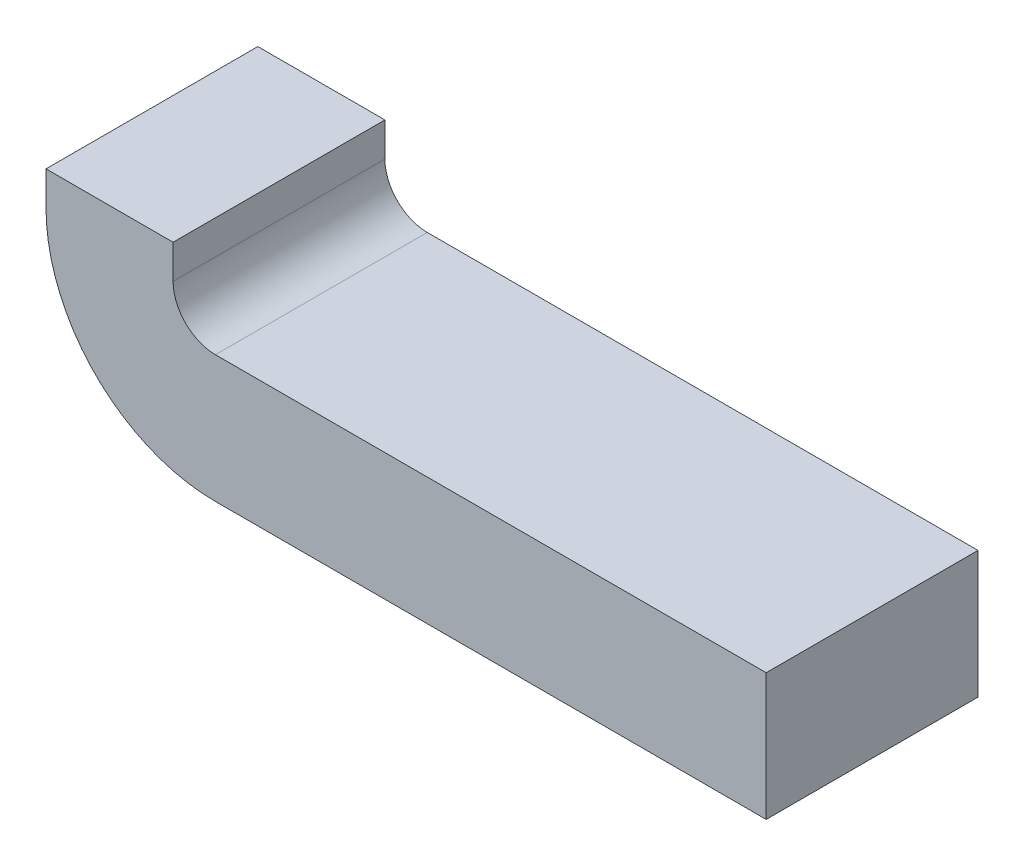
ISO-10303-21;
HEADER;
FILE_DESCRIPTION(('STEP AP214'),'2;1');
FILE_NAME('part.step','',(''),(''),'','','');
FILE_SCHEMA(('AUTOMOTIVE_DESIGN { 1 0 10303 214 1 1 1 1 }'));
ENDSEC;
DATA;
#1=APPLICATION_CONTEXT('core data for automotive mechanical design processes');
#2=APPLICATION_PROTOCOL_DEFINITION('international standard','automotive_design',2000,#1);
#3=PRODUCT_CONTEXT('',#1,'mechanical');
#4=PRODUCT('Part','Part','',(#3));
#5=PRODUCT_RELATED_PRODUCT_CATEGORY('part','',(#4));
#6=PRODUCT_DEFINITION_FORMATION('','',#4);
#7=PRODUCT_DEFINITION_CONTEXT('part definition',#1,'design');
#8=PRODUCT_DEFINITION('design','',#6,#7);
#9=PRODUCT_DEFINITION_SHAPE('','',#8);
#10=(LENGTH_UNIT() NAMED_UNIT(*) SI_UNIT(.MILLI.,.METRE.));
#11=(NAMED_UNIT(*) PLANE_ANGLE_UNIT() SI_UNIT($,.RADIAN.));
#12=(NAMED_UNIT(*) SI_UNIT($,.STERADIAN.) SOLID_ANGLE_UNIT());
#13=UNCERTAINTY_MEASURE_WITH_UNIT(LENGTH_MEASURE(1.E-05),#10,'distance_accuracy_value','');
#14=(GEOMETRIC_REPRESENTATION_CONTEXT(3) GLOBAL_UNCERTAINTY_ASSIGNED_CONTEXT((#13)) GLOBAL_UNIT_ASSIGNED_CONTEXT((#10,
#11,#12)) REPRESENTATION_CONTEXT('',''));
#15=CARTESIAN_POINT('',(0.,0.,0.));
#16=DIRECTION('',(0.,0.,1.));
#17=DIRECTION('',(1.,0.,0.));
#18=AXIS2_PLACEMENT_3D('',#15,#16,#17);
#19=CARTESIAN_POINT('',(-17.3099999991093,3.305,0.775000000000022));
#20=DIRECTION('',(0.,1.,0.));
#21=DIRECTION('',(1.,0.,0.));
#22=AXIS2_PLACEMENT_3D('',#19,#20,#21);
#23=PLANE('',#22);
#24=DIRECTION('',(0.,0.,-1.));
#25=VECTOR('',#24,1.);
#26=CARTESIAN_POINT('',(-17.3099999991093,3.305,0.775000000000022));
#27=LINE('',#26,#25);
#28=CARTESIAN_POINT('',(-17.3099999991093,3.305,0.775000000000022));
#29=VERTEX_POINT('',#28);
#30=CARTESIAN_POINT('',(-17.3099999991093,3.305,0.525000000000022));
#31=VERTEX_POINT('',#30);
#32=EDGE_CURVE('E11',#29,#31,#27,.T.);
#33=ORIENTED_EDGE('',*,*,#32,.F.);
#34=DIRECTION('',(1.,0.,0.));
#35=VECTOR('',#34,1.);
#36=CARTESIAN_POINT('',(-17.3099999991093,3.305,0.775000000000022));
#37=LINE('',#36,#35);
#38=CARTESIAN_POINT('',(-17.9599999991093,3.305,0.775000000000022));
#39=VERTEX_POINT('',#38);
#40=EDGE_CURVE('E24',#39,#29,#37,.T.);
#41=ORIENTED_EDGE('',*,*,#40,.F.);
#42=DIRECTION('',(0.,0.,1.));
#43=VECTOR('',#42,1.);
#44=CARTESIAN_POINT('',(-17.9599999991093,3.305,0.775000000000022));
#45=LINE('',#44,#43);
#46=CARTESIAN_POINT('',(-17.9599999991093,3.305,0.525000000000022));
#47=VERTEX_POINT('',#46);
#48=EDGE_CURVE('E96',#47,#39,#45,.T.);
#49=ORIENTED_EDGE('',*,*,#48,.F.);
#50=DIRECTION('',(-1.,0.,0.));
#51=VECTOR('',#50,1.);
#52=CARTESIAN_POINT('',(-17.3099999991093,3.305,0.525000000000022));
#53=LINE('',#52,#51);
#54=EDGE_CURVE('E138',#31,#47,#53,.T.);
#55=ORIENTED_EDGE('',*,*,#54,.F.);
#56=EDGE_LOOP('',(#33,#41,#49,#55));
#57=FACE_BOUND('',#56,.T.);
#58=ADVANCED_FACE('F17',(#57),#23,.F.);
#59=CARTESIAN_POINT('',(-17.9599999991093,3.505,0.525000000000022));
#60=DIRECTION('',(0.,0.,-1.));
#61=DIRECTION('',(0.,-1.,0.));
#62=AXIS2_PLACEMENT_3D('',#59,#60,#61);
#63=PLANE('',#62);
#64=DIRECTION('',(1.,0.,0.));
#65=VECTOR('',#64,1.);
#66=CARTESIAN_POINT('',(-17.9599999991093,3.455,0.525000000000022));
#67=LINE('',#66,#65);
#68=CARTESIAN_POINT('',(-17.9599999991093,3.455,0.525000000000022));
#69=VERTEX_POINT('',#68);
#70=CARTESIAN_POINT('',(-17.3099999991093,3.455,0.525000000000022));
#71=VERTEX_POINT('',#70);
#72=EDGE_CURVE('E136',#69,#71,#67,.T.);
#73=ORIENTED_EDGE('',*,*,#72,.T.);
#74=DIRECTION('',(0.,-1.,0.));
#75=VECTOR('',#74,1.);
#76=CARTESIAN_POINT('',(-17.3099999991093,3.505,0.525000000000022));
#77=LINE('',#76,#75);
#78=EDGE_CURVE('E133',#71,#31,#77,.T.);
#79=ORIENTED_EDGE('',*,*,#78,.T.);
#80=ORIENTED_EDGE('',*,*,#54,.T.);
#81=CARTESIAN_POINT('',(-17.9599999991093,3.505,0.525000000000022));
#82=DIRECTION('',(0.,0.,-1.));
#83=DIRECTION('',(-1.,0.,0.));
#84=AXIS2_PLACEMENT_3D('',#81,#82,#83);
#85=CIRCLE('',#84,0.199999999999999);
#86=CARTESIAN_POINT('',(-18.1599999991093,3.505,0.525000000000022));
#87=VERTEX_POINT('',#86);
#88=EDGE_CURVE('E131',#47,#87,#85,.T.);
#89=ORIENTED_EDGE('',*,*,#88,.T.);
#90=DIRECTION('',(0.,1.,0.));
#91=VECTOR('',#90,1.);
#92=CARTESIAN_POINT('',(-18.1599999991093,3.505,0.525000000000022));
#93=LINE('',#92,#91);
#94=CARTESIAN_POINT('',(-18.1599999991093,3.545,0.525000000000022));
#95=VERTEX_POINT('',#94);
#96=EDGE_CURVE('E100',#87,#95,#93,.T.);
#97=ORIENTED_EDGE('',*,*,#96,.T.);
#98=DIRECTION('',(1.,0.,0.));
#99=VECTOR('',#98,1.);
#100=CARTESIAN_POINT('',(-17.9599999991093,3.545,0.525000000000022));
#101=LINE('',#100,#99);
#102=CARTESIAN_POINT('',(-18.0099999991093,3.545,0.525000000000022));
#103=VERTEX_POINT('',#102);
#104=EDGE_CURVE('E128',#95,#103,#101,.T.);
#105=ORIENTED_EDGE('',*,*,#104,.T.);
#106=DIRECTION('',(0.,-1.,0.));
#107=VECTOR('',#106,1.);
#108=CARTESIAN_POINT('',(-18.0099999991093,3.505,0.525000000000022));
#109=LINE('',#108,#107);
#110=CARTESIAN_POINT('',(-18.0099999991093,3.505,0.525000000000022));
#111=VERTEX_POINT('',#110);
#112=EDGE_CURVE('E126',#103,#111,#109,.T.);
#113=ORIENTED_EDGE('',*,*,#112,.T.);
#114=CARTESIAN_POINT('',(-17.9599999991093,3.505,0.525000000000022));
#115=DIRECTION('',(0.,0.,1.));
#116=DIRECTION('',(-1.,0.,0.));
#117=AXIS2_PLACEMENT_3D('',#114,#115,#116);
#118=CIRCLE('',#117,0.0500000000000014);
#119=EDGE_CURVE('E123',#111,#69,#118,.T.);
#120=ORIENTED_EDGE('',*,*,#119,.T.);
#121=EDGE_LOOP('',(#73,#79,#80,#89,#97,#105,#113,#120));
#122=FACE_BOUND('',#121,.T.);
#123=ADVANCED_FACE('F162',(#122),#63,.T.);
#124=CARTESIAN_POINT('',(-17.3099999991093,3.455,0.775000000000022));
#125=DIRECTION('',(-1.,0.,0.));
#126=DIRECTION('',(0.,0.,1.));
#127=AXIS2_PLACEMENT_3D('',#124,#125,#126);
#128=PLANE('',#127);
#129=DIRECTION('',(0.,0.,-1.));
#130=VECTOR('',#129,1.);
#131=CARTESIAN_POINT('',(-17.3099999991093,3.455,0.775000000000022));
#132=LINE('',#131,#130);
#133=CARTESIAN_POINT('',(-17.3099999991093,3.455,0.775000000000022));
#134=VERTEX_POINT('',#133);
#135=EDGE_CURVE('E120',#134,#71,#132,.T.);
#136=ORIENTED_EDGE('',*,*,#135,.F.);
#137=DIRECTION('',(0.,1.,0.));
#138=VECTOR('',#137,1.);
#139=CARTESIAN_POINT('',(-17.3099999991093,3.455,0.775000000000022));
#140=LINE('',#139,#138);
#141=EDGE_CURVE('E118',#29,#134,#140,.T.);
#142=ORIENTED_EDGE('',*,*,#141,.F.);
#143=ORIENTED_EDGE('',*,*,#32,.T.);
#144=ORIENTED_EDGE('',*,*,#78,.F.);
#145=EDGE_LOOP('',(#136,#142,#143,#144));
#146=FACE_BOUND('',#145,.T.);
#147=ADVANCED_FACE('F141',(#146),#128,.F.);
#148=CARTESIAN_POINT('',(-17.9599999991093,3.505,0.775000000000022));
#149=DIRECTION('',(0.,0.,-1.));
#150=DIRECTION('',(0.,-1.,0.));
#151=AXIS2_PLACEMENT_3D('',#148,#149,#150);
#152=PLANE('',#151);
#153=ORIENTED_EDGE('',*,*,#141,.T.);
#154=DIRECTION('',(1.,0.,0.));
#155=VECTOR('',#154,1.);
#156=CARTESIAN_POINT('',(-17.9599999991093,3.455,0.775000000000022));
#157=LINE('',#156,#155);
#158=CARTESIAN_POINT('',(-17.9599999991093,3.455,0.775000000000022));
#159=VERTEX_POINT('',#158);
#160=EDGE_CURVE('E115',#159,#134,#157,.T.);
#161=ORIENTED_EDGE('',*,*,#160,.F.);
#162=CARTESIAN_POINT('',(-17.9599999991093,3.505,0.775000000000022));
#163=DIRECTION('',(0.,0.,1.));
#164=DIRECTION('',(-1.,0.,0.));
#165=AXIS2_PLACEMENT_3D('',#162,#163,#164);
#166=CIRCLE('',#165,0.0500000000000014);
#167=CARTESIAN_POINT('',(-18.0099999991093,3.505,0.775000000000022));
#168=VERTEX_POINT('',#167);
#169=EDGE_CURVE('E112',#168,#159,#166,.T.);
#170=ORIENTED_EDGE('',*,*,#169,.F.);
#171=DIRECTION('',(0.,-1.,0.));
#172=VECTOR('',#171,1.);
#173=CARTESIAN_POINT('',(-18.0099999991093,3.505,0.775000000000022));
#174=LINE('',#173,#172);
#175=CARTESIAN_POINT('',(-18.0099999991093,3.545,0.775000000000022));
#176=VERTEX_POINT('',#175);
#177=EDGE_CURVE('E109',#176,#168,#174,.T.);
#178=ORIENTED_EDGE('',*,*,#177,.F.);
#179=DIRECTION('',(1.,0.,0.));
#180=VECTOR('',#179,1.);
#181=CARTESIAN_POINT('',(-17.9599999991093,3.545,0.775000000000022));
#182=LINE('',#181,#180);
#183=CARTESIAN_POINT('',(-18.1599999991093,3.545,0.775000000000022));
#184=VERTEX_POINT('',#183);
#185=EDGE_CURVE('E84',#184,#176,#182,.T.);
#186=ORIENTED_EDGE('',*,*,#185,.F.);
#187=DIRECTION('',(0.,1.,0.));
#188=VECTOR('',#187,1.);
#189=CARTESIAN_POINT('',(-18.1599999991093,3.505,0.775000000000022));
#190=LINE('',#189,#188);
#191=CARTESIAN_POINT('',(-18.1599999991093,3.505,0.775000000000022));
#192=VERTEX_POINT('',#191);
#193=EDGE_CURVE('E78',#192,#184,#190,.T.);
#194=ORIENTED_EDGE('',*,*,#193,.F.);
#195=CARTESIAN_POINT('',(-17.9599999991093,3.505,0.775000000000022));
#196=DIRECTION('',(0.,0.,-1.));
#197=DIRECTION('',(-1.,0.,0.));
#198=AXIS2_PLACEMENT_3D('',#195,#196,#197);
#199=CIRCLE('',#198,0.199999999999999);
#200=EDGE_CURVE('E82',#39,#192,#199,.T.);
#201=ORIENTED_EDGE('',*,*,#200,.F.);
#202=ORIENTED_EDGE('',*,*,#40,.T.);
#203=EDGE_LOOP('',(#153,#161,#170,#178,#186,#194,#201,#202));
#204=FACE_BOUND('',#203,.T.);
#205=ADVANCED_FACE('F81',(#204),#152,.F.);
#206=CARTESIAN_POINT('',(-17.9599999991093,3.505,0.775000000000022));
#207=DIRECTION('',(0.,0.,-1.));
#208=DIRECTION('',(-1.,0.,0.));
#209=AXIS2_PLACEMENT_3D('',#206,#207,#208);
#210=CYLINDRICAL_SURFACE('',#209,0.199999999999999);
#211=ORIENTED_EDGE('',*,*,#200,.T.);
#212=DIRECTION('',(0.,0.,-1.));
#213=VECTOR('',#212,1.);
#214=CARTESIAN_POINT('',(-18.1599999991093,3.505,0.775000000000022));
#215=LINE('',#214,#213);
#216=EDGE_CURVE('E95',#192,#87,#215,.T.);
#217=ORIENTED_EDGE('',*,*,#216,.T.);
#218=ORIENTED_EDGE('',*,*,#88,.F.);
#219=ORIENTED_EDGE('',*,*,#48,.T.);
#220=EDGE_LOOP('',(#211,#217,#218,#219));
#221=FACE_BOUND('',#220,.T.);
#222=ADVANCED_FACE('F93',(#221),#210,.T.);
#223=CARTESIAN_POINT('',(-17.9599999991093,3.455,0.775000000000022));
#224=DIRECTION('',(0.,-1.,0.));
#225=DIRECTION('',(-1.,0.,0.));
#226=AXIS2_PLACEMENT_3D('',#223,#224,#225);
#227=PLANE('',#226);
#228=DIRECTION('',(0.,0.,-1.));
#229=VECTOR('',#228,1.);
#230=CARTESIAN_POINT('',(-17.9599999991093,3.455,0.775000000000022));
#231=LINE('',#230,#229);
#232=EDGE_CURVE('E101',#159,#69,#231,.T.);
#233=ORIENTED_EDGE('',*,*,#232,.F.);
#234=ORIENTED_EDGE('',*,*,#160,.T.);
#235=ORIENTED_EDGE('',*,*,#135,.T.);
#236=ORIENTED_EDGE('',*,*,#72,.F.);
#237=EDGE_LOOP('',(#233,#234,#235,#236));
#238=FACE_BOUND('',#237,.T.);
#239=ADVANCED_FACE('F144',(#238),#227,.F.);
#240=CARTESIAN_POINT('',(-17.9599999991093,3.505,0.775000000000022));
#241=DIRECTION('',(0.,0.,-1.));
#242=DIRECTION('',(-1.,0.,0.));
#243=AXIS2_PLACEMENT_3D('',#240,#241,#242);
#244=CYLINDRICAL_SURFACE('',#243,0.0500000000000014);
#245=DIRECTION('',(0.,0.,-1.));
#246=VECTOR('',#245,1.);
#247=CARTESIAN_POINT('',(-18.0099999991093,3.505,0.775000000000022));
#248=LINE('',#247,#246);
#249=EDGE_CURVE('E104',#168,#111,#248,.T.);
#250=ORIENTED_EDGE('',*,*,#249,.F.);
#251=ORIENTED_EDGE('',*,*,#169,.T.);
#252=ORIENTED_EDGE('',*,*,#232,.T.);
#253=ORIENTED_EDGE('',*,*,#119,.F.);
#254=EDGE_LOOP('',(#250,#251,#252,#253));
#255=FACE_BOUND('',#254,.T.);
#256=ADVANCED_FACE('F147',(#255),#244,.F.);
#257=CARTESIAN_POINT('',(-18.0099999991093,3.505,0.775000000000022));
#258=DIRECTION('',(-1.,0.,0.));
#259=DIRECTION('',(0.,0.,1.));
#260=AXIS2_PLACEMENT_3D('',#257,#258,#259);
#261=PLANE('',#260);
#262=DIRECTION('',(0.,0.,-1.));
#263=VECTOR('',#262,1.);
#264=CARTESIAN_POINT('',(-18.0099999991093,3.545,0.775000000000022));
#265=LINE('',#264,#263);
#266=EDGE_CURVE('E152',#176,#103,#265,.T.);
#267=ORIENTED_EDGE('',*,*,#266,.F.);
#268=ORIENTED_EDGE('',*,*,#177,.T.);
#269=ORIENTED_EDGE('',*,*,#249,.T.);
#270=ORIENTED_EDGE('',*,*,#112,.F.);
#271=EDGE_LOOP('',(#267,#268,#269,#270));
#272=FACE_BOUND('',#271,.T.);
#273=ADVANCED_FACE('F163',(#272),#261,.F.);
#274=CARTESIAN_POINT('',(-18.0099999991093,3.545,0.775000000000022));
#275=DIRECTION('',(0.,-1.,0.));
#276=DIRECTION('',(-1.,0.,0.));
#277=AXIS2_PLACEMENT_3D('',#274,#275,#276);
#278=PLANE('',#277);
#279=DIRECTION('',(0.,0.,-1.));
#280=VECTOR('',#279,1.);
#281=CARTESIAN_POINT('',(-18.1599999991093,3.545,0.775000000000022));
#282=LINE('',#281,#280);
#283=EDGE_CURVE('E154',#184,#95,#282,.T.);
#284=ORIENTED_EDGE('',*,*,#283,.F.);
#285=ORIENTED_EDGE('',*,*,#185,.T.);
#286=ORIENTED_EDGE('',*,*,#266,.T.);
#287=ORIENTED_EDGE('',*,*,#104,.F.);
#288=EDGE_LOOP('',(#284,#285,#286,#287));
#289=FACE_BOUND('',#288,.T.);
#290=ADVANCED_FACE('F159',(#289),#278,.F.);
#291=CARTESIAN_POINT('',(-18.1599999991093,3.545,0.775000000000022));
#292=DIRECTION('',(1.,0.,0.));
#293=DIRECTION('',(0.,0.,1.));
#294=AXIS2_PLACEMENT_3D('',#291,#292,#293);
#295=PLANE('',#294);
#296=ORIENTED_EDGE('',*,*,#216,.F.);
#297=ORIENTED_EDGE('',*,*,#193,.T.);
#298=ORIENTED_EDGE('',*,*,#283,.T.);
#299=ORIENTED_EDGE('',*,*,#96,.F.);
#300=EDGE_LOOP('',(#296,#297,#298,#299));
#301=FACE_BOUND('',#300,.T.);
#302=ADVANCED_FACE('F99',(#301),#295,.F.);
#303=CLOSED_SHELL('',(#58,#123,#147,#205,#222,#239,#256,#273,#290,#302));
#304=MANIFOLD_SOLID_BREP('B1',#303);
#305=ADVANCED_BREP_SHAPE_REPRESENTATION('',(#18,#304),#14);
#306=SHAPE_DEFINITION_REPRESENTATION(#9,#305);
ENDSEC;
END-ISO-10303-21;
